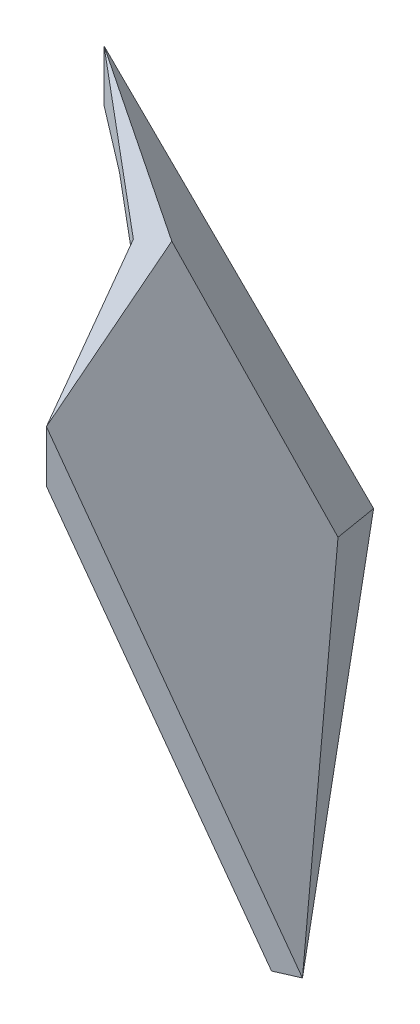
ISO-10303-21;
HEADER;
FILE_DESCRIPTION(('STEP AP214'),'2;1');
FILE_NAME('part.step','',(''),(''),'','','');
FILE_SCHEMA(('AUTOMOTIVE_DESIGN { 1 0 10303 214 1 1 1 1 }'));
ENDSEC;
DATA;
#1=APPLICATION_CONTEXT('core data for automotive mechanical design processes');
#2=APPLICATION_PROTOCOL_DEFINITION('international standard','automotive_design',2000,#1);
#3=PRODUCT_CONTEXT('',#1,'mechanical');
#4=PRODUCT('Part','Part','',(#3));
#5=PRODUCT_RELATED_PRODUCT_CATEGORY('part','',(#4));
#6=PRODUCT_DEFINITION_FORMATION('','',#4);
#7=PRODUCT_DEFINITION_CONTEXT('part definition',#1,'design');
#8=PRODUCT_DEFINITION('design','',#6,#7);
#9=PRODUCT_DEFINITION_SHAPE('','',#8);
#10=(LENGTH_UNIT() NAMED_UNIT(*) SI_UNIT(.MILLI.,.METRE.));
#11=(NAMED_UNIT(*) PLANE_ANGLE_UNIT() SI_UNIT($,.RADIAN.));
#12=(NAMED_UNIT(*) SI_UNIT($,.STERADIAN.) SOLID_ANGLE_UNIT());
#13=UNCERTAINTY_MEASURE_WITH_UNIT(LENGTH_MEASURE(1.E-05),#10,'distance_accuracy_value','');
#14=(GEOMETRIC_REPRESENTATION_CONTEXT(3) GLOBAL_UNCERTAINTY_ASSIGNED_CONTEXT((#13)) GLOBAL_UNIT_ASSIGNED_CONTEXT((#10,
#11,#12)) REPRESENTATION_CONTEXT('',''));
#15=CARTESIAN_POINT('',(0.,0.,0.));
#16=DIRECTION('',(0.,0.,1.));
#17=DIRECTION('',(1.,0.,0.));
#18=AXIS2_PLACEMENT_3D('',#15,#16,#17);
#19=CARTESIAN_POINT('',(0.,40.,0.));
#20=DIRECTION('',(0.866025403784439,0.,-0.5));
#21=DIRECTION('',(-0.5,0.,-0.866025403784439));
#22=AXIS2_PLACEMENT_3D('',#19,#20,#21);
#23=PLANE('',#22);
#24=DIRECTION('',(-0.485944411812596,0.235440256779588,-0.841680410913591));
#25=VECTOR('',#24,1.);
#26=CARTESIAN_POINT('',(0.0631373967127835,40.521257758187,0.109357178964173));
#27=LINE('',#26,#25);
#28=CARTESIAN_POINT('',(11.1134833706833,35.1673608301197,19.2491178470954));
#29=VERTEX_POINT('',#28);
#30=CARTESIAN_POINT('',(5.26696759588339,38.,9.12265547788893));
#31=VERTEX_POINT('',#30);
#32=EDGE_CURVE('E169',#29,#31,#27,.T.);
#33=ORIENTED_EDGE('',*,*,#32,.F.);
#34=DIRECTION('',(0.,-1.,0.));
#35=VECTOR('',#34,1.);
#36=CARTESIAN_POINT('',(11.1134833706833,40.,19.2491178470954));
#37=LINE('',#36,#35);
#38=CARTESIAN_POINT('',(11.1134833706833,40.,19.2491178470954));
#39=VERTEX_POINT('',#38);
#40=EDGE_CURVE('E209',#39,#29,#37,.T.);
#41=ORIENTED_EDGE('',*,*,#40,.F.);
#42=DIRECTION('',(0.5,0.,0.866025403784439));
#43=VECTOR('',#42,1.);
#44=CARTESIAN_POINT('',(0.,40.,0.));
#45=LINE('',#44,#43);
#46=CARTESIAN_POINT('',(0.,40.,0.));
#47=VERTEX_POINT('',#46);
#48=EDGE_CURVE('E204',#47,#39,#45,.T.);
#49=ORIENTED_EDGE('',*,*,#48,.F.);
#50=DIRECTION('',(0.,-1.,0.));
#51=VECTOR('',#50,1.);
#52=CARTESIAN_POINT('',(0.,40.,0.));
#53=LINE('',#52,#51);
#54=CARTESIAN_POINT('',(0.,38.,0.));
#55=VERTEX_POINT('',#54);
#56=EDGE_CURVE('E58',#47,#55,#53,.T.);
#57=ORIENTED_EDGE('',*,*,#56,.T.);
#58=DIRECTION('',(0.5,0.,0.866025403784439));
#59=VECTOR('',#58,1.);
#60=CARTESIAN_POINT('',(0.,38.,0.));
#61=LINE('',#60,#59);
#62=EDGE_CURVE('E156',#55,#31,#61,.T.);
#63=ORIENTED_EDGE('',*,*,#62,.T.);
#64=EDGE_LOOP('',(#33,#41,#49,#57,#63));
#65=FACE_BOUND('',#64,.T.);
#66=ADVANCED_FACE('F49',(#65),#23,.F.);
#67=CARTESIAN_POINT('',(8.87168928857276,40.,20.2321333408349));
#68=DIRECTION('',(-0.401583540376797,0.,-0.915822395499497));
#69=DIRECTION('',(-0.915822395499497,0.,0.401583540376797));
#70=AXIS2_PLACEMENT_3D('',#67,#68,#69);
#71=PLANE('',#70);
#72=ORIENTED_EDGE('',*,*,#40,.T.);
#73=DIRECTION('',(0.379015425445959,-0.910343931896387,-0.166196368592834));
#74=VECTOR('',#73,1.);
#75=CARTESIAN_POINT('',(9.44605664980776,39.1722949180791,19.9802761253583));
#76=LINE('',#75,#74);
#77=CARTESIAN_POINT('',(25.7551718137238,0.,12.8288106882566));
#78=VERTEX_POINT('',#77);
#79=EDGE_CURVE('E139',#29,#78,#76,.T.);
#80=ORIENTED_EDGE('',*,*,#79,.T.);
#81=DIRECTION('',(0.915822395499497,0.,-0.401583540376797));
#82=VECTOR('',#81,1.);
#83=CARTESIAN_POINT('',(8.87168928857276,0.,20.2321333408349));
#84=LINE('',#83,#82);
#85=CARTESIAN_POINT('',(27.7672078440881,0.,11.9465429511823));
#86=VERTEX_POINT('',#85);
#87=EDGE_CURVE('E194',#78,#86,#84,.T.);
#88=ORIENTED_EDGE('',*,*,#87,.T.);
#89=DIRECTION('',(0.379015425445959,-0.910343931896387,-0.166196368592834));
#90=VECTOR('',#89,1.);
#91=CARTESIAN_POINT('',(11.1134833706833,40.,19.2491178470954));
#92=LINE('',#91,#90);
#93=EDGE_CURVE('E189',#39,#86,#92,.T.);
#94=ORIENTED_EDGE('',*,*,#93,.F.);
#95=EDGE_LOOP('',(#72,#80,#88,#94));
#96=FACE_BOUND('',#95,.T.);
#97=ADVANCED_FACE('F51',(#96),#71,.F.);
#98=CARTESIAN_POINT('',(10.4119423825497,40.,-8.73665701303526));
#99=DIRECTION('',(-0.766044443119023,0.,0.642787609686485));
#100=DIRECTION('',(0.642787609686485,0.,0.766044443119023));
#101=AXIS2_PLACEMENT_3D('',#98,#99,#100);
#102=PLANE('',#101);
#103=DIRECTION('',(-0.642787609686485,0.,-0.766044443119023));
#104=VECTOR('',#103,1.);
#105=CARTESIAN_POINT('',(10.4119423825497,0.,-8.73665701303526));
#106=LINE('',#105,#104);
#107=CARTESIAN_POINT('',(-6.94332307898206,0.,-29.4198569772449));
#108=VERTEX_POINT('',#107);
#109=EDGE_CURVE('E212',#86,#108,#106,.T.);
#110=ORIENTED_EDGE('',*,*,#109,.T.);
#111=DIRECTION('',(0.546743003155132,0.525843858099236,0.651582938235969));
#112=VECTOR('',#111,1.);
#113=CARTESIAN_POINT('',(17.1130653374153,23.1368376436688,-0.750569657157444));
#114=LINE('',#113,#112);
#115=CARTESIAN_POINT('',(10.4119423825698,16.6918638116516,-8.73665701301125));
#116=VERTEX_POINT('',#115);
#117=EDGE_CURVE('E181',#108,#116,#114,.T.);
#118=ORIENTED_EDGE('',*,*,#117,.T.);
#119=DIRECTION('',(-0.546743003154839,0.525843858099972,-0.65158293823562));
#120=VECTOR('',#119,1.);
#121=CARTESIAN_POINT('',(-44.6591612182375,69.6578851784957,-74.3678425774107));
#122=LINE('',#121,#120);
#123=EDGE_CURVE('E190',#86,#116,#122,.T.);
#124=ORIENTED_EDGE('',*,*,#123,.F.);
#125=EDGE_LOOP('',(#110,#118,#124));
#126=FACE_BOUND('',#125,.T.);
#127=ADVANCED_FACE('F252',(#126),#102,.F.);
#128=CARTESIAN_POINT('',(-18.3842090962359,40.,-12.2501814786661));
#129=DIRECTION('',(0.83217474550226,0.,0.5545134740908));
#130=DIRECTION('',(0.5545134740908,0.,-0.83217474550226));
#131=AXIS2_PLACEMENT_3D('',#128,#129,#130);
#132=PLANE('',#131);
#133=DIRECTION('',(-0.5545134740908,0.,0.83217474550226));
#134=VECTOR('',#133,1.);
#135=CARTESIAN_POINT('',(-18.3842090962359,0.,-12.2501814786661));
#136=LINE('',#135,#134);
#137=CARTESIAN_POINT('',(-8.16157357675967,0.,-27.5915924799604));
#138=VERTEX_POINT('',#137);
#139=EDGE_CURVE('E205',#108,#138,#136,.T.);
#140=ORIENTED_EDGE('',*,*,#139,.T.);
#141=DIRECTION('',(-0.229486810249288,0.910343931896387,0.344397632949231));
#142=VECTOR('',#141,1.);
#143=CARTESIAN_POINT('',(-18.0364403122008,39.1722949180791,-12.7720883625746));
#144=LINE('',#143,#142);
#145=CARTESIAN_POINT('',(-17.0268443596142,35.1673608301197,-14.2872188222654));
#146=VERTEX_POINT('',#145);
#147=EDGE_CURVE('E151',#138,#146,#144,.T.);
#148=ORIENTED_EDGE('',*,*,#147,.T.);
#149=DIRECTION('',(0.,-1.,0.));
#150=VECTOR('',#149,1.);
#151=CARTESIAN_POINT('',(-17.0268443596142,40.,-14.2872188222654));
#152=LINE('',#151,#150);
#153=CARTESIAN_POINT('',(-17.0268443596142,40.,-14.2872188222654));
#154=VERTEX_POINT('',#153);
#155=EDGE_CURVE('E11',#154,#146,#152,.T.);
#156=ORIENTED_EDGE('',*,*,#155,.F.);
#157=DIRECTION('',(-0.229486810249288,0.910343931896387,0.344397632949231));
#158=VECTOR('',#157,1.);
#159=CARTESIAN_POINT('',(-17.0268443596142,40.,-14.2872188222654));
#160=LINE('',#159,#158);
#161=EDGE_CURVE('E177',#108,#154,#160,.T.);
#162=ORIENTED_EDGE('',*,*,#161,.F.);
#163=EDGE_LOOP('',(#140,#148,#156,#162));
#164=FACE_BOUND('',#163,.T.);
#165=ADVANCED_FACE('F246',(#164),#132,.F.);
#166=CARTESIAN_POINT('',(0.,40.,0.));
#167=DIRECTION('',(0.642787609686546,0.,-0.766044443118973));
#168=DIRECTION('',(-0.766044443118973,0.,-0.642787609686546));
#169=AXIS2_PLACEMENT_3D('',#166,#167,#168);
#170=PLANE('',#169);
#171=DIRECTION('',(-0.744510032667775,-0.235440256778186,-0.624718093819325));
#172=VECTOR('',#171,1.);
#173=CARTESIAN_POINT('',(-0.0967321038031537,40.5212577581552,-0.0811678726242323));
#174=LINE('',#173,#172);
#175=CARTESIAN_POINT('',(-8.06946251777181,38.,-6.77108302246133));
#176=VERTEX_POINT('',#175);
#177=EDGE_CURVE('E174',#176,#146,#174,.T.);
#178=ORIENTED_EDGE('',*,*,#177,.F.);
#179=DIRECTION('',(0.766044443118973,0.,0.642787609686546));
#180=VECTOR('',#179,1.);
#181=CARTESIAN_POINT('',(0.,38.,0.));
#182=LINE('',#181,#180);
#183=EDGE_CURVE('E146',#176,#55,#182,.T.);
#184=ORIENTED_EDGE('',*,*,#183,.T.);
#185=ORIENTED_EDGE('',*,*,#56,.F.);
#186=DIRECTION('',(0.766044443118973,0.,0.642787609686546));
#187=VECTOR('',#186,1.);
#188=CARTESIAN_POINT('',(0.,40.,0.));
#189=LINE('',#188,#187);
#190=EDGE_CURVE('E201',#154,#47,#189,.T.);
#191=ORIENTED_EDGE('',*,*,#190,.F.);
#192=ORIENTED_EDGE('',*,*,#155,.T.);
#193=EDGE_LOOP('',(#178,#184,#185,#191,#192));
#194=FACE_BOUND('',#193,.T.);
#195=ADVANCED_FACE('F231',(#194),#170,.F.);
#196=CARTESIAN_POINT('',(0.,40.,0.));
#197=DIRECTION('',(0.,1.,0.));
#198=DIRECTION('',(0.,0.,1.));
#199=AXIS2_PLACEMENT_3D('',#196,#197,#198);
#200=PLANE('',#199);
#201=DIRECTION('',(-0.83217474550226,0.,-0.5545134740908));
#202=VECTOR('',#201,1.);
#203=CARTESIAN_POINT('',(59.6820924107712,40.,36.8272126745534));
#204=LINE('',#203,#202);
#205=CARTESIAN_POINT('',(1.95391575795095,40.,-1.63952999181106));
#206=VERTEX_POINT('',#205);
#207=EDGE_CURVE('E73',#206,#154,#204,.T.);
#208=ORIENTED_EDGE('',*,*,#207,.T.);
#209=ORIENTED_EDGE('',*,*,#190,.T.);
#210=ORIENTED_EDGE('',*,*,#48,.T.);
#211=DIRECTION('',(0.401583540376797,0.,0.915822395499497));
#212=VECTOR('',#211,1.);
#213=CARTESIAN_POINT('',(-41.5692278945683,40.,-100.895265528481));
#214=LINE('',#213,#212);
#215=EDGE_CURVE('E195',#206,#39,#214,.T.);
#216=ORIENTED_EDGE('',*,*,#215,.F.);
#217=EDGE_LOOP('',(#208,#209,#210,#216));
#218=FACE_BOUND('',#217,.T.);
#219=ADVANCED_FACE('F242',(#218),#200,.T.);
#220=CARTESIAN_POINT('',(0.,0.,0.));
#221=DIRECTION('',(0.,1.,0.));
#222=DIRECTION('',(0.,0.,1.));
#223=AXIS2_PLACEMENT_3D('',#220,#221,#222);
#224=PLANE('',#223);
#225=DIRECTION('',(-0.642787609686485,0.,-0.766044443119023));
#226=VECTOR('',#225,1.);
#227=CARTESIAN_POINT('',(8.87985349631161,0.,-7.45108179366228));
#228=LINE('',#227,#226);
#229=CARTESIAN_POINT('',(25.6002533170305,0.,12.4755147622939));
#230=VERTEX_POINT('',#229);
#231=CARTESIAN_POINT('',(-7.84054632440014,0.,-27.3776783496099));
#232=VERTEX_POINT('',#231);
#233=EDGE_CURVE('E65',#230,#232,#228,.T.);
#234=ORIENTED_EDGE('',*,*,#233,.T.);
#235=DIRECTION('',(-0.83217474550226,0.,-0.5545134740908));
#236=VECTOR('',#235,1.);
#237=CARTESIAN_POINT('',(68.5473631936257,0.,23.5228390168585));
#238=LINE('',#237,#236);
#239=EDGE_CURVE('E137',#232,#138,#238,.T.);
#240=ORIENTED_EDGE('',*,*,#239,.T.);
#241=ORIENTED_EDGE('',*,*,#139,.F.);
#242=ORIENTED_EDGE('',*,*,#109,.F.);
#243=ORIENTED_EDGE('',*,*,#87,.F.);
#244=DIRECTION('',(0.401583540376797,0.,0.915822395499497));
#245=VECTOR('',#244,1.);
#246=CARTESIAN_POINT('',(16.883482525151,0.,-7.4033226525783));
#247=LINE('',#246,#245);
#248=EDGE_CURVE('E160',#230,#78,#247,.T.);
#249=ORIENTED_EDGE('',*,*,#248,.F.);
#250=EDGE_LOOP('',(#234,#240,#241,#242,#243,#249));
#251=FACE_BOUND('',#250,.T.);
#252=ADVANCED_FACE('F249',(#251),#224,.F.);
#253=CARTESIAN_POINT('',(-41.5692278945683,40.,-100.895265528481));
#254=DIRECTION('',(-0.83371336043778,-0.413852540960456,0.365579139131485));
#255=DIRECTION('',(0.444629692523654,-0.895714483820777,0.));
#256=AXIS2_PLACEMENT_3D('',#253,#254,#255);
#257=PLANE('',#256);
#258=ORIENTED_EDGE('',*,*,#123,.T.);
#259=DIRECTION('',(0.327944652571379,-0.903730735739882,-0.275178237019007));
#260=VECTOR('',#259,1.);
#261=CARTESIAN_POINT('',(4.6910849450615,32.4570688867276,-3.93628764718369));
#262=LINE('',#261,#260);
#263=EDGE_CURVE('E178',#206,#116,#262,.T.);
#264=ORIENTED_EDGE('',*,*,#263,.F.);
#265=ORIENTED_EDGE('',*,*,#215,.T.);
#266=ORIENTED_EDGE('',*,*,#93,.T.);
#267=EDGE_LOOP('',(#258,#264,#265,#266));
#268=FACE_BOUND('',#267,.T.);
#269=ADVANCED_FACE('F253',(#268),#257,.F.);
#270=CARTESIAN_POINT('',(59.6820924107712,40.,36.8272126745534));
#271=DIRECTION('',(-0.504797976293345,-0.413852540960456,0.757565229845403));
#272=DIRECTION('',(0.83217474550226,0.,0.5545134740908));
#273=AXIS2_PLACEMENT_3D('',#270,#271,#272);
#274=PLANE('',#273);
#275=ORIENTED_EDGE('',*,*,#161,.T.);
#276=ORIENTED_EDGE('',*,*,#207,.F.);
#277=ORIENTED_EDGE('',*,*,#263,.T.);
#278=ORIENTED_EDGE('',*,*,#117,.F.);
#279=EDGE_LOOP('',(#275,#276,#277,#278));
#280=FACE_BOUND('',#279,.T.);
#281=ADVANCED_FACE('F254',(#280),#274,.F.);
#282=CARTESIAN_POINT('',(8.87985349631161,40.,-7.45108179366228));
#283=DIRECTION('',(-0.766044443119023,0.,0.642787609686485));
#284=DIRECTION('',(0.642787609686485,0.,0.766044443119023));
#285=AXIS2_PLACEMENT_3D('',#282,#283,#284);
#286=PLANE('',#285);
#287=ORIENTED_EDGE('',*,*,#233,.F.);
#288=DIRECTION('',(-0.546743003154839,0.525843858099972,-0.65158293823562));
#289=VECTOR('',#288,1.);
#290=CARTESIAN_POINT('',(-46.3667979221511,69.2161246898888,-73.2914771004246));
#291=LINE('',#290,#289);
#292=CARTESIAN_POINT('',(8.87985349633137,16.0812657865884,-7.45108179363873));
#293=VERTEX_POINT('',#292);
#294=EDGE_CURVE('E126',#230,#293,#291,.T.);
#295=ORIENTED_EDGE('',*,*,#294,.T.);
#296=DIRECTION('',(0.546743003155132,0.525843858099236,0.651582938235969));
#297=VECTOR('',#296,1.);
#298=CARTESIAN_POINT('',(15.7565242688524,22.6950771550619,0.744215304602024));
#299=LINE('',#298,#297);
#300=EDGE_CURVE('E132',#232,#293,#299,.T.);
#301=ORIENTED_EDGE('',*,*,#300,.F.);
#302=EDGE_LOOP('',(#287,#295,#301));
#303=FACE_BOUND('',#302,.T.);
#304=ADVANCED_FACE('F141',(#303),#286,.T.);
#305=CARTESIAN_POINT('',(0.,38.,0.));
#306=DIRECTION('',(0.,1.,0.));
#307=DIRECTION('',(0.,0.,1.));
#308=AXIS2_PLACEMENT_3D('',#305,#306,#307);
#309=PLANE('',#308);
#310=DIRECTION('',(-0.83217474550226,0.,-0.5545134740908));
#311=VECTOR('',#310,1.);
#312=CARTESIAN_POINT('',(58.9680179770252,38.,37.8988452640889));
#313=LINE('',#312,#311);
#314=CARTESIAN_POINT('',(0.926011281883794,38.,-0.777015725058279));
#315=VERTEX_POINT('',#314);
#316=EDGE_CURVE('E133',#315,#176,#313,.T.);
#317=ORIENTED_EDGE('',*,*,#316,.F.);
#318=DIRECTION('',(0.401583540376797,0.,0.915822395499497));
#319=VECTOR('',#318,1.);
#320=CARTESIAN_POINT('',(1.06244427541655,38.,-0.465876501460891));
#321=LINE('',#320,#319);
#322=EDGE_CURVE('E129',#315,#31,#321,.T.);
#323=ORIENTED_EDGE('',*,*,#322,.T.);
#324=ORIENTED_EDGE('',*,*,#62,.F.);
#325=ORIENTED_EDGE('',*,*,#183,.F.);
#326=EDGE_LOOP('',(#317,#323,#324,#325));
#327=FACE_BOUND('',#326,.T.);
#328=ADVANCED_FACE('F234',(#327),#309,.F.);
#329=CARTESIAN_POINT('',(-43.2366546154439,39.1722949180791,-100.164107250218));
#330=DIRECTION('',(-0.83371336043778,-0.413852540960456,0.365579139131485));
#331=DIRECTION('',(0.444629692523654,-0.895714483820777,0.));
#332=AXIS2_PLACEMENT_3D('',#329,#330,#331);
#333=PLANE('',#332);
#334=ORIENTED_EDGE('',*,*,#294,.F.);
#335=ORIENTED_EDGE('',*,*,#248,.T.);
#336=ORIENTED_EDGE('',*,*,#79,.F.);
#337=ORIENTED_EDGE('',*,*,#32,.T.);
#338=ORIENTED_EDGE('',*,*,#322,.F.);
#339=DIRECTION('',(0.327944652571379,-0.903730735739882,-0.275178237019007));
#340=VECTOR('',#339,1.);
#341=CARTESIAN_POINT('',(3.25881797643313,31.5713874464072,-2.73447296206108));
#342=LINE('',#341,#340);
#343=EDGE_CURVE('E123',#315,#293,#342,.T.);
#344=ORIENTED_EDGE('',*,*,#343,.T.);
#345=EDGE_LOOP('',(#334,#335,#336,#337,#338,#344));
#346=FACE_BOUND('',#345,.T.);
#347=ADVANCED_FACE('F125',(#346),#333,.T.);
#348=CARTESIAN_POINT('',(58.6724964581845,39.1722949180791,38.3423431342442));
#349=DIRECTION('',(-0.504797976293345,-0.413852540960456,0.757565229845403));
#350=DIRECTION('',(0.83217474550226,0.,0.5545134740908));
#351=AXIS2_PLACEMENT_3D('',#348,#349,#350);
#352=PLANE('',#351);
#353=ORIENTED_EDGE('',*,*,#147,.F.);
#354=ORIENTED_EDGE('',*,*,#239,.F.);
#355=ORIENTED_EDGE('',*,*,#300,.T.);
#356=ORIENTED_EDGE('',*,*,#343,.F.);
#357=ORIENTED_EDGE('',*,*,#316,.T.);
#358=ORIENTED_EDGE('',*,*,#177,.T.);
#359=EDGE_LOOP('',(#353,#354,#355,#356,#357,#358));
#360=FACE_BOUND('',#359,.T.);
#361=ADVANCED_FACE('F135',(#360),#352,.T.);
#362=CLOSED_SHELL('',(#66,#97,#127,#165,#195,#219,#252,#269,#281,#304,#328,#347,#361));
#363=MANIFOLD_SOLID_BREP('B2',#362);
#364=ADVANCED_BREP_SHAPE_REPRESENTATION('',(#18,#363),#14);
#365=SHAPE_DEFINITION_REPRESENTATION(#9,#364);
ENDSEC;
END-ISO-10303-21;
